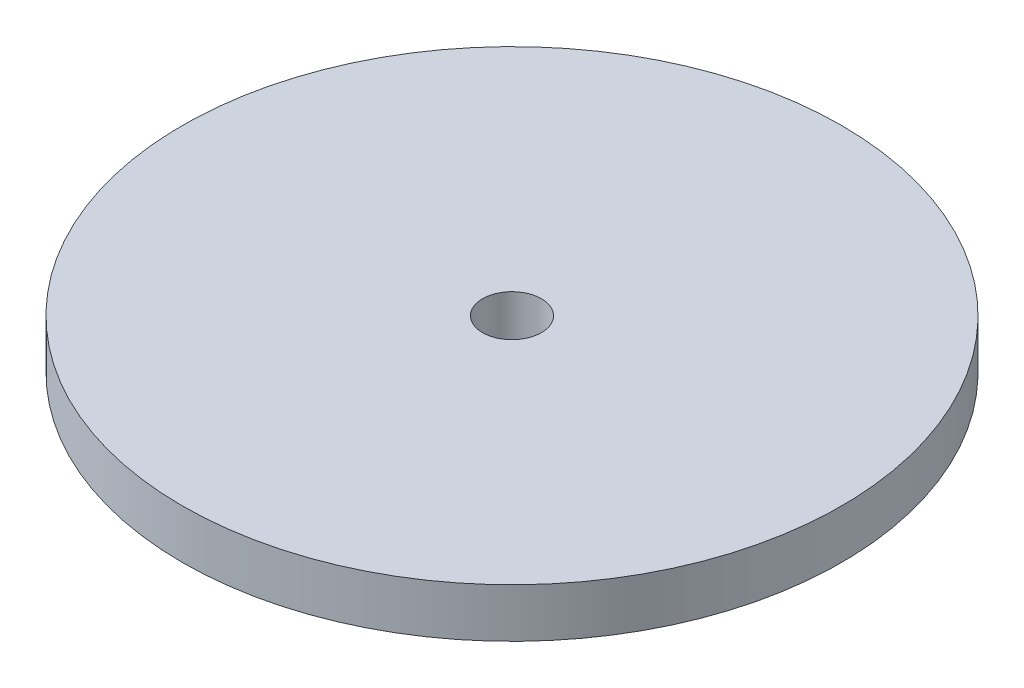
ISO-10303-21;
HEADER;
FILE_DESCRIPTION(('STEP AP214'),'2;1');
FILE_NAME('part.step','',(''),(''),'','','');
FILE_SCHEMA(('AUTOMOTIVE_DESIGN { 1 0 10303 214 1 1 1 1 }'));
ENDSEC;
DATA;
#1=APPLICATION_CONTEXT('core data for automotive mechanical design processes');
#2=APPLICATION_PROTOCOL_DEFINITION('international standard','automotive_design',2000,#1);
#3=PRODUCT_CONTEXT('',#1,'mechanical');
#4=PRODUCT('Part','Part','',(#3));
#5=PRODUCT_RELATED_PRODUCT_CATEGORY('part','',(#4));
#6=PRODUCT_DEFINITION_FORMATION('','',#4);
#7=PRODUCT_DEFINITION_CONTEXT('part definition',#1,'design');
#8=PRODUCT_DEFINITION('design','',#6,#7);
#9=PRODUCT_DEFINITION_SHAPE('','',#8);
#10=(LENGTH_UNIT() NAMED_UNIT(*) SI_UNIT(.MILLI.,.METRE.));
#11=(NAMED_UNIT(*) PLANE_ANGLE_UNIT() SI_UNIT($,.RADIAN.));
#12=(NAMED_UNIT(*) SI_UNIT($,.STERADIAN.) SOLID_ANGLE_UNIT());
#13=UNCERTAINTY_MEASURE_WITH_UNIT(LENGTH_MEASURE(1.E-05),#10,'distance_accuracy_value','');
#14=(GEOMETRIC_REPRESENTATION_CONTEXT(3) GLOBAL_UNCERTAINTY_ASSIGNED_CONTEXT((#13)) GLOBAL_UNIT_ASSIGNED_CONTEXT((#10,
#11,#12)) REPRESENTATION_CONTEXT('',''));
#15=CARTESIAN_POINT('',(0.,0.,0.));
#16=DIRECTION('',(0.,0.,1.));
#17=DIRECTION('',(1.,0.,0.));
#18=AXIS2_PLACEMENT_3D('',#15,#16,#17);
#19=CARTESIAN_POINT('',(0.,2.89613683961817,0.));
#20=DIRECTION('',(0.,-1.,0.));
#21=DIRECTION('',(0.,0.,-1.));
#22=AXIS2_PLACEMENT_3D('',#19,#20,#21);
#23=CYLINDRICAL_SURFACE('',#22,1.8);
#24=CARTESIAN_POINT('',(0.,6.39810199171116,0.));
#25=DIRECTION('',(0.,-1.,0.));
#26=DIRECTION('',(0.,0.,-1.));
#27=AXIS2_PLACEMENT_3D('',#24,#25,#26);
#28=CIRCLE('',#27,1.8);
#29=CARTESIAN_POINT('',(0.,6.39810199171116,-1.8));
#30=VERTEX_POINT('',#29);
#31=EDGE_CURVE('E39',#30,#30,#28,.T.);
#32=ORIENTED_EDGE('',*,*,#31,.T.);
#33=EDGE_LOOP('',(#32));
#34=FACE_BOUND('',#33,.T.);
#35=CARTESIAN_POINT('',(0.,9.39810199171116,0.));
#36=DIRECTION('',(0.,-1.,0.));
#37=DIRECTION('',(0.,0.,-1.));
#38=AXIS2_PLACEMENT_3D('',#35,#36,#37);
#39=CIRCLE('',#38,1.8);
#40=CARTESIAN_POINT('',(0.,9.39810199171116,-1.8));
#41=VERTEX_POINT('',#40);
#42=EDGE_CURVE('E11',#41,#41,#39,.T.);
#43=ORIENTED_EDGE('',*,*,#42,.F.);
#44=EDGE_LOOP('',(#43));
#45=FACE_BOUND('',#44,.T.);
#46=ADVANCED_FACE('F18',(#34,#45),#23,.F.);
#47=CARTESIAN_POINT('',(-10.9824433717131,9.39810199171115,0.));
#48=DIRECTION('',(0.,-1.,0.));
#49=DIRECTION('',(0.,0.,-1.));
#50=AXIS2_PLACEMENT_3D('',#47,#48,#49);
#51=PLANE('',#50);
#52=CARTESIAN_POINT('',(0.,9.39810199171114,0.));
#53=DIRECTION('',(0.,-1.,0.));
#54=DIRECTION('',(0.,0.,-1.));
#55=AXIS2_PLACEMENT_3D('',#52,#53,#54);
#56=CIRCLE('',#55,20.1648867434263);
#57=CARTESIAN_POINT('',(0.,9.39810199171114,-20.1648867434263));
#58=VERTEX_POINT('',#57);
#59=EDGE_CURVE('E26',#58,#58,#56,.T.);
#60=ORIENTED_EDGE('',*,*,#59,.F.);
#61=EDGE_LOOP('',(#60));
#62=FACE_BOUND('',#61,.T.);
#63=ORIENTED_EDGE('',*,*,#42,.T.);
#64=EDGE_LOOP('',(#63));
#65=FACE_BOUND('',#64,.T.);
#66=ADVANCED_FACE('F62',(#62,#65),#51,.F.);
#67=CARTESIAN_POINT('',(0.,2.89613683961817,0.));
#68=DIRECTION('',(0.,-1.,0.));
#69=DIRECTION('',(0.,0.,-1.));
#70=AXIS2_PLACEMENT_3D('',#67,#68,#69);
#71=CYLINDRICAL_SURFACE('',#70,20.1648867434263);
#72=CARTESIAN_POINT('',(0.,6.39810199171115,0.));
#73=DIRECTION('',(0.,-1.,0.));
#74=DIRECTION('',(0.,0.,-1.));
#75=AXIS2_PLACEMENT_3D('',#72,#73,#74);
#76=CIRCLE('',#75,20.1648867434263);
#77=CARTESIAN_POINT('',(0.,6.39810199171115,-20.1648867434263));
#78=VERTEX_POINT('',#77);
#79=EDGE_CURVE('E33',#78,#78,#76,.T.);
#80=ORIENTED_EDGE('',*,*,#79,.F.);
#81=EDGE_LOOP('',(#80));
#82=FACE_BOUND('',#81,.T.);
#83=ORIENTED_EDGE('',*,*,#59,.T.);
#84=EDGE_LOOP('',(#83));
#85=FACE_BOUND('',#84,.T.);
#86=ADVANCED_FACE('F55',(#82,#85),#71,.T.);
#87=CARTESIAN_POINT('',(-10.9824433717131,6.39810199171115,0.));
#88=DIRECTION('',(0.,-1.,0.));
#89=DIRECTION('',(0.,0.,-1.));
#90=AXIS2_PLACEMENT_3D('',#87,#88,#89);
#91=PLANE('',#90);
#92=ORIENTED_EDGE('',*,*,#79,.T.);
#93=EDGE_LOOP('',(#92));
#94=FACE_BOUND('',#93,.T.);
#95=ORIENTED_EDGE('',*,*,#31,.F.);
#96=EDGE_LOOP('',(#95));
#97=FACE_BOUND('',#96,.T.);
#98=ADVANCED_FACE('F53',(#94,#97),#91,.T.);
#99=CLOSED_SHELL('',(#46,#66,#86,#98));
#100=MANIFOLD_SOLID_BREP('B1',#99);
#101=ADVANCED_BREP_SHAPE_REPRESENTATION('',(#18,#100),#14);
#102=SHAPE_DEFINITION_REPRESENTATION(#9,#101);
ENDSEC;
END-ISO-10303-21;
